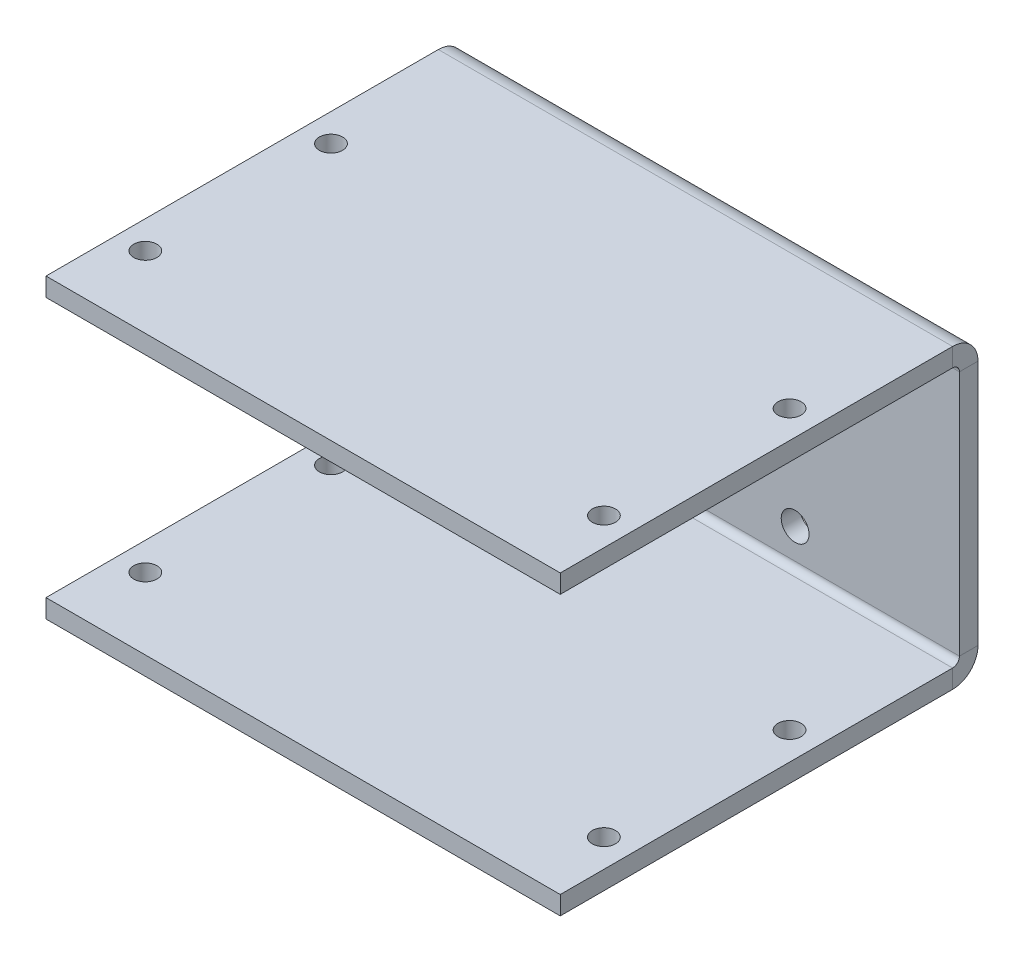
ISO-10303-21;
HEADER;
FILE_DESCRIPTION(('STEP AP214'),'2;1');
FILE_NAME('part.step','',(''),(''),'','','');
FILE_SCHEMA(('AUTOMOTIVE_DESIGN { 1 0 10303 214 1 1 1 1 }'));
ENDSEC;
DATA;
#1=APPLICATION_CONTEXT('core data for automotive mechanical design processes');
#2=APPLICATION_PROTOCOL_DEFINITION('international standard','automotive_design',2000,#1);
#3=PRODUCT_CONTEXT('',#1,'mechanical');
#4=PRODUCT('Part','Part','',(#3));
#5=PRODUCT_RELATED_PRODUCT_CATEGORY('part','',(#4));
#6=PRODUCT_DEFINITION_FORMATION('','',#4);
#7=PRODUCT_DEFINITION_CONTEXT('part definition',#1,'design');
#8=PRODUCT_DEFINITION('design','',#6,#7);
#9=PRODUCT_DEFINITION_SHAPE('','',#8);
#10=(LENGTH_UNIT() NAMED_UNIT(*) SI_UNIT(.MILLI.,.METRE.));
#11=(NAMED_UNIT(*) PLANE_ANGLE_UNIT() SI_UNIT($,.RADIAN.));
#12=(NAMED_UNIT(*) SI_UNIT($,.STERADIAN.) SOLID_ANGLE_UNIT());
#13=UNCERTAINTY_MEASURE_WITH_UNIT(LENGTH_MEASURE(1.E-05),#10,'distance_accuracy_value','');
#14=(GEOMETRIC_REPRESENTATION_CONTEXT(3) GLOBAL_UNCERTAINTY_ASSIGNED_CONTEXT((#13)) GLOBAL_UNIT_ASSIGNED_CONTEXT((#10,
#11,#12)) REPRESENTATION_CONTEXT('',''));
#15=CARTESIAN_POINT('',(0.,0.,0.));
#16=DIRECTION('',(0.,0.,1.));
#17=DIRECTION('',(1.,0.,0.));
#18=AXIS2_PLACEMENT_3D('',#15,#16,#17);
#19=CARTESIAN_POINT('',(0.,0.,-2.));
#20=DIRECTION('',(0.,0.,-1.));
#21=DIRECTION('',(-1.,0.,0.));
#22=AXIS2_PLACEMENT_3D('',#19,#20,#21);
#23=PLANE('',#22);
#24=CARTESIAN_POINT('',(10.,10.,-2.));
#25=DIRECTION('',(0.,0.,-1.));
#26=DIRECTION('',(-1.,0.,0.));
#27=AXIS2_PLACEMENT_3D('',#24,#25,#26);
#28=CIRCLE('',#27,1.5);
#29=CARTESIAN_POINT('',(8.5,10.,-2.));
#30=VERTEX_POINT('',#29);
#31=EDGE_CURVE('E238',#30,#30,#28,.T.);
#32=ORIENTED_EDGE('',*,*,#31,.F.);
#33=EDGE_LOOP('',(#32));
#34=FACE_BOUND('',#33,.T.);
#35=CARTESIAN_POINT('',(-10.,10.,-2.));
#36=DIRECTION('',(0.,0.,-1.));
#37=DIRECTION('',(-1.,0.,0.));
#38=AXIS2_PLACEMENT_3D('',#35,#36,#37);
#39=CIRCLE('',#38,1.5);
#40=CARTESIAN_POINT('',(-11.5,10.,-2.));
#41=VERTEX_POINT('',#40);
#42=EDGE_CURVE('E246',#41,#41,#39,.T.);
#43=ORIENTED_EDGE('',*,*,#42,.F.);
#44=EDGE_LOOP('',(#43));
#45=FACE_BOUND('',#44,.T.);
#46=CARTESIAN_POINT('',(-10.,-10.,-2.));
#47=DIRECTION('',(0.,0.,-1.));
#48=DIRECTION('',(-1.,0.,0.));
#49=AXIS2_PLACEMENT_3D('',#46,#47,#48);
#50=CIRCLE('',#49,1.5);
#51=CARTESIAN_POINT('',(-11.5,-10.,-2.));
#52=VERTEX_POINT('',#51);
#53=EDGE_CURVE('E250',#52,#52,#50,.T.);
#54=ORIENTED_EDGE('',*,*,#53,.F.);
#55=EDGE_LOOP('',(#54));
#56=FACE_BOUND('',#55,.T.);
#57=CARTESIAN_POINT('',(10.,-10.,-2.));
#58=DIRECTION('',(0.,0.,-1.));
#59=DIRECTION('',(-1.,0.,0.));
#60=AXIS2_PLACEMENT_3D('',#57,#58,#59);
#61=CIRCLE('',#60,1.5);
#62=CARTESIAN_POINT('',(8.5,-10.,-2.));
#63=VERTEX_POINT('',#62);
#64=EDGE_CURVE('E256',#63,#63,#61,.T.);
#65=ORIENTED_EDGE('',*,*,#64,.F.);
#66=EDGE_LOOP('',(#65));
#67=FACE_BOUND('',#66,.T.);
#68=DIRECTION('',(0.,1.,0.));
#69=VECTOR('',#68,1.);
#70=CARTESIAN_POINT('',(27.7,-14.,-2.));
#71=LINE('',#70,#69);
#72=CARTESIAN_POINT('',(27.7,-13.2634,-2.));
#73=VERTEX_POINT('',#72);
#74=CARTESIAN_POINT('',(27.7,13.2634,-2.));
#75=VERTEX_POINT('',#74);
#76=EDGE_CURVE('E49',#73,#75,#71,.T.);
#77=ORIENTED_EDGE('',*,*,#76,.F.);
#78=DIRECTION('',(1.,0.,0.));
#79=VECTOR('',#78,1.);
#80=CARTESIAN_POINT('',(27.7,-13.2634,-2.));
#81=LINE('',#80,#79);
#82=CARTESIAN_POINT('',(-27.7,-13.2634,-2.));
#83=VERTEX_POINT('',#82);
#84=EDGE_CURVE('E135',#73,#83,#81,.F.);
#85=ORIENTED_EDGE('',*,*,#84,.T.);
#86=DIRECTION('',(0.,-1.,0.));
#87=VECTOR('',#86,1.);
#88=CARTESIAN_POINT('',(-27.7,-14.,-2.));
#89=LINE('',#88,#87);
#90=CARTESIAN_POINT('',(-27.7,13.2634,-2.));
#91=VERTEX_POINT('',#90);
#92=EDGE_CURVE('E11',#91,#83,#89,.T.);
#93=ORIENTED_EDGE('',*,*,#92,.F.);
#94=DIRECTION('',(-1.,0.,0.));
#95=VECTOR('',#94,1.);
#96=CARTESIAN_POINT('',(-27.7,13.2634,-2.));
#97=LINE('',#96,#95);
#98=EDGE_CURVE('E221',#91,#75,#97,.F.);
#99=ORIENTED_EDGE('',*,*,#98,.T.);
#100=EDGE_LOOP('',(#77,#85,#93,#99));
#101=FACE_BOUND('',#100,.T.);
#102=ADVANCED_FACE('F40',(#34,#45,#56,#67,#101),#23,.T.);
#103=CARTESIAN_POINT('',(0.,0.,0.));
#104=DIRECTION('',(0.,0.,-1.));
#105=DIRECTION('',(-1.,0.,0.));
#106=AXIS2_PLACEMENT_3D('',#103,#104,#105);
#107=PLANE('',#106);
#108=CARTESIAN_POINT('',(10.,10.,0.));
#109=DIRECTION('',(0.,0.,-1.));
#110=DIRECTION('',(-1.,0.,0.));
#111=AXIS2_PLACEMENT_3D('',#108,#109,#110);
#112=CIRCLE('',#111,1.5);
#113=CARTESIAN_POINT('',(8.5,10.,0.));
#114=VERTEX_POINT('',#113);
#115=EDGE_CURVE('E243',#114,#114,#112,.T.);
#116=ORIENTED_EDGE('',*,*,#115,.T.);
#117=EDGE_LOOP('',(#116));
#118=FACE_BOUND('',#117,.T.);
#119=CARTESIAN_POINT('',(-10.,10.,0.));
#120=DIRECTION('',(0.,0.,-1.));
#121=DIRECTION('',(-1.,0.,0.));
#122=AXIS2_PLACEMENT_3D('',#119,#120,#121);
#123=CIRCLE('',#122,1.5);
#124=CARTESIAN_POINT('',(-11.5,10.,0.));
#125=VERTEX_POINT('',#124);
#126=EDGE_CURVE('E249',#125,#125,#123,.T.);
#127=ORIENTED_EDGE('',*,*,#126,.T.);
#128=EDGE_LOOP('',(#127));
#129=FACE_BOUND('',#128,.T.);
#130=CARTESIAN_POINT('',(-10.,-10.,0.));
#131=DIRECTION('',(0.,0.,-1.));
#132=DIRECTION('',(-1.,0.,0.));
#133=AXIS2_PLACEMENT_3D('',#130,#131,#132);
#134=CIRCLE('',#133,1.5);
#135=CARTESIAN_POINT('',(-11.5,-10.,0.));
#136=VERTEX_POINT('',#135);
#137=EDGE_CURVE('E253',#136,#136,#134,.T.);
#138=ORIENTED_EDGE('',*,*,#137,.T.);
#139=EDGE_LOOP('',(#138));
#140=FACE_BOUND('',#139,.T.);
#141=CARTESIAN_POINT('',(10.,-10.,0.));
#142=DIRECTION('',(0.,0.,-1.));
#143=DIRECTION('',(-1.,0.,0.));
#144=AXIS2_PLACEMENT_3D('',#141,#142,#143);
#145=CIRCLE('',#144,1.5);
#146=CARTESIAN_POINT('',(8.5,-10.,0.));
#147=VERTEX_POINT('',#146);
#148=EDGE_CURVE('E259',#147,#147,#145,.T.);
#149=ORIENTED_EDGE('',*,*,#148,.T.);
#150=EDGE_LOOP('',(#149));
#151=FACE_BOUND('',#150,.T.);
#152=DIRECTION('',(1.,0.,0.));
#153=VECTOR('',#152,1.);
#154=CARTESIAN_POINT('',(27.7,-13.2634,0.));
#155=LINE('',#154,#153);
#156=CARTESIAN_POINT('',(27.7,-13.2634,0.));
#157=VERTEX_POINT('',#156);
#158=CARTESIAN_POINT('',(-27.7,-13.2634,0.));
#159=VERTEX_POINT('',#158);
#160=EDGE_CURVE('E184',#157,#159,#155,.F.);
#161=ORIENTED_EDGE('',*,*,#160,.F.);
#162=DIRECTION('',(0.,1.,0.));
#163=VECTOR('',#162,1.);
#164=CARTESIAN_POINT('',(27.7,-14.,0.));
#165=LINE('',#164,#163);
#166=CARTESIAN_POINT('',(27.7,13.2634,0.));
#167=VERTEX_POINT('',#166);
#168=EDGE_CURVE('E262',#157,#167,#165,.T.);
#169=ORIENTED_EDGE('',*,*,#168,.T.);
#170=DIRECTION('',(-1.,0.,0.));
#171=VECTOR('',#170,1.);
#172=CARTESIAN_POINT('',(-27.7,13.2634,0.));
#173=LINE('',#172,#171);
#174=CARTESIAN_POINT('',(-27.7,13.2634,0.));
#175=VERTEX_POINT('',#174);
#176=EDGE_CURVE('E232',#175,#167,#173,.F.);
#177=ORIENTED_EDGE('',*,*,#176,.F.);
#178=DIRECTION('',(0.,-1.,0.));
#179=VECTOR('',#178,1.);
#180=CARTESIAN_POINT('',(-27.7,-14.,0.));
#181=LINE('',#180,#179);
#182=EDGE_CURVE('E264',#175,#159,#181,.T.);
#183=ORIENTED_EDGE('',*,*,#182,.T.);
#184=EDGE_LOOP('',(#161,#169,#177,#183));
#185=FACE_BOUND('',#184,.T.);
#186=ADVANCED_FACE('F347',(#118,#129,#140,#151,#185),#107,.F.);
#187=CARTESIAN_POINT('',(27.7,-14.,-2.));
#188=DIRECTION('',(1.,0.,0.));
#189=DIRECTION('',(0.,0.,-1.));
#190=AXIS2_PLACEMENT_3D('',#187,#188,#189);
#191=PLANE('',#190);
#192=ORIENTED_EDGE('',*,*,#168,.F.);
#193=DIRECTION('',(0.,0.,-1.));
#194=VECTOR('',#193,1.);
#195=CARTESIAN_POINT('',(27.7,-13.2634,0.));
#196=LINE('',#195,#194);
#197=EDGE_CURVE('E180',#157,#73,#196,.T.);
#198=ORIENTED_EDGE('',*,*,#197,.T.);
#199=ORIENTED_EDGE('',*,*,#76,.T.);
#200=DIRECTION('',(0.,0.,-1.));
#201=VECTOR('',#200,1.);
#202=CARTESIAN_POINT('',(27.7,13.2634,0.));
#203=LINE('',#202,#201);
#204=EDGE_CURVE('E236',#167,#75,#203,.T.);
#205=ORIENTED_EDGE('',*,*,#204,.F.);
#206=EDGE_LOOP('',(#192,#198,#199,#205));
#207=FACE_BOUND('',#206,.T.);
#208=ADVANCED_FACE('F42',(#207),#191,.T.);
#209=CARTESIAN_POINT('',(-27.7,-14.,-2.));
#210=DIRECTION('',(-1.,0.,0.));
#211=DIRECTION('',(0.,0.,1.));
#212=AXIS2_PLACEMENT_3D('',#209,#210,#211);
#213=PLANE('',#212);
#214=DIRECTION('',(0.,0.,-1.));
#215=VECTOR('',#214,1.);
#216=CARTESIAN_POINT('',(-27.7,-13.2634,0.));
#217=LINE('',#216,#215);
#218=EDGE_CURVE('E187',#159,#83,#217,.T.);
#219=ORIENTED_EDGE('',*,*,#218,.F.);
#220=ORIENTED_EDGE('',*,*,#182,.F.);
#221=DIRECTION('',(0.,0.,-1.));
#222=VECTOR('',#221,1.);
#223=CARTESIAN_POINT('',(-27.7,13.2634,0.));
#224=LINE('',#223,#222);
#225=EDGE_CURVE('E226',#175,#91,#224,.T.);
#226=ORIENTED_EDGE('',*,*,#225,.T.);
#227=ORIENTED_EDGE('',*,*,#92,.T.);
#228=EDGE_LOOP('',(#219,#220,#226,#227));
#229=FACE_BOUND('',#228,.T.);
#230=ADVANCED_FACE('F360',(#229),#213,.T.);
#231=CARTESIAN_POINT('',(10.,-10.,-2.));
#232=DIRECTION('',(0.,0.,-1.));
#233=DIRECTION('',(-1.,0.,0.));
#234=AXIS2_PLACEMENT_3D('',#231,#232,#233);
#235=CYLINDRICAL_SURFACE('',#234,1.5);
#236=ORIENTED_EDGE('',*,*,#64,.T.);
#237=EDGE_LOOP('',(#236));
#238=FACE_BOUND('',#237,.T.);
#239=ORIENTED_EDGE('',*,*,#148,.F.);
#240=EDGE_LOOP('',(#239));
#241=FACE_BOUND('',#240,.T.);
#242=ADVANCED_FACE('F358',(#238,#241),#235,.F.);
#243=CARTESIAN_POINT('',(-10.,-10.,-2.));
#244=DIRECTION('',(0.,0.,-1.));
#245=DIRECTION('',(-1.,0.,0.));
#246=AXIS2_PLACEMENT_3D('',#243,#244,#245);
#247=CYLINDRICAL_SURFACE('',#246,1.5);
#248=ORIENTED_EDGE('',*,*,#53,.T.);
#249=EDGE_LOOP('',(#248));
#250=FACE_BOUND('',#249,.T.);
#251=ORIENTED_EDGE('',*,*,#137,.F.);
#252=EDGE_LOOP('',(#251));
#253=FACE_BOUND('',#252,.T.);
#254=ADVANCED_FACE('F367',(#250,#253),#247,.F.);
#255=CARTESIAN_POINT('',(-10.,10.,-2.));
#256=DIRECTION('',(0.,0.,-1.));
#257=DIRECTION('',(-1.,0.,0.));
#258=AXIS2_PLACEMENT_3D('',#255,#256,#257);
#259=CYLINDRICAL_SURFACE('',#258,1.5);
#260=ORIENTED_EDGE('',*,*,#42,.T.);
#261=EDGE_LOOP('',(#260));
#262=FACE_BOUND('',#261,.T.);
#263=ORIENTED_EDGE('',*,*,#126,.F.);
#264=EDGE_LOOP('',(#263));
#265=FACE_BOUND('',#264,.T.);
#266=ADVANCED_FACE('F425',(#262,#265),#259,.F.);
#267=CARTESIAN_POINT('',(10.,10.,-2.));
#268=DIRECTION('',(0.,0.,-1.));
#269=DIRECTION('',(-1.,0.,0.));
#270=AXIS2_PLACEMENT_3D('',#267,#268,#269);
#271=CYLINDRICAL_SURFACE('',#270,1.5);
#272=ORIENTED_EDGE('',*,*,#31,.T.);
#273=EDGE_LOOP('',(#272));
#274=FACE_BOUND('',#273,.T.);
#275=ORIENTED_EDGE('',*,*,#115,.F.);
#276=EDGE_LOOP('',(#275));
#277=FACE_BOUND('',#276,.T.);
#278=ADVANCED_FACE('F420',(#274,#277),#271,.F.);
#279=CARTESIAN_POINT('',(27.7,13.2634,0.7366));
#280=DIRECTION('',(1.,0.,0.));
#281=DIRECTION('',(0.,0.,-1.));
#282=AXIS2_PLACEMENT_3D('',#279,#280,#281);
#283=PLANE('',#282);
#284=DIRECTION('',(0.,1.,0.));
#285=VECTOR('',#284,1.);
#286=CARTESIAN_POINT('',(27.7,14.,0.736599999999997));
#287=LINE('',#286,#285);
#288=CARTESIAN_POINT('',(27.7,14.,0.736599999999997));
#289=VERTEX_POINT('',#288);
#290=CARTESIAN_POINT('',(27.7,16.,0.73659999999999));
#291=VERTEX_POINT('',#290);
#292=EDGE_CURVE('E189',#289,#291,#287,.T.);
#293=ORIENTED_EDGE('',*,*,#292,.F.);
#294=CARTESIAN_POINT('',(27.7,13.2634,0.7366));
#295=DIRECTION('',(-1.,0.,0.));
#296=DIRECTION('',(0.,0.,1.));
#297=AXIS2_PLACEMENT_3D('',#294,#295,#296);
#298=CIRCLE('',#297,0.7366);
#299=EDGE_CURVE('E229',#167,#289,#298,.F.);
#300=ORIENTED_EDGE('',*,*,#299,.F.);
#301=ORIENTED_EDGE('',*,*,#204,.T.);
#302=CARTESIAN_POINT('',(27.7,13.2634,0.7366));
#303=DIRECTION('',(-1.,0.,0.));
#304=DIRECTION('',(0.,0.,1.));
#305=AXIS2_PLACEMENT_3D('',#302,#303,#304);
#306=CIRCLE('',#305,2.7366);
#307=EDGE_CURVE('E57',#75,#291,#306,.F.);
#308=ORIENTED_EDGE('',*,*,#307,.T.);
#309=EDGE_LOOP('',(#293,#300,#301,#308));
#310=FACE_BOUND('',#309,.T.);
#311=ADVANCED_FACE('F382',(#310),#283,.T.);
#312=CARTESIAN_POINT('',(-27.7,13.2634,0.7366));
#313=DIRECTION('',(1.,0.,0.));
#314=DIRECTION('',(0.,0.,-1.));
#315=AXIS2_PLACEMENT_3D('',#312,#313,#314);
#316=PLANE('',#315);
#317=CARTESIAN_POINT('',(-27.7,13.2634,0.7366));
#318=DIRECTION('',(-1.,0.,0.));
#319=DIRECTION('',(0.,0.,1.));
#320=AXIS2_PLACEMENT_3D('',#317,#318,#319);
#321=CIRCLE('',#320,0.7366);
#322=CARTESIAN_POINT('',(-27.7,14.,0.736599999999997));
#323=VERTEX_POINT('',#322);
#324=EDGE_CURVE('E220',#323,#175,#321,.T.);
#325=ORIENTED_EDGE('',*,*,#324,.F.);
#326=DIRECTION('',(0.,1.,0.));
#327=VECTOR('',#326,1.);
#328=CARTESIAN_POINT('',(-27.7,14.,0.736599999999997));
#329=LINE('',#328,#327);
#330=CARTESIAN_POINT('',(-27.7,16.,0.73659999999999));
#331=VERTEX_POINT('',#330);
#332=EDGE_CURVE('E193',#323,#331,#329,.T.);
#333=ORIENTED_EDGE('',*,*,#332,.T.);
#334=CARTESIAN_POINT('',(-27.7,13.2634,0.7366));
#335=DIRECTION('',(-1.,0.,0.));
#336=DIRECTION('',(0.,0.,1.));
#337=AXIS2_PLACEMENT_3D('',#334,#335,#336);
#338=CIRCLE('',#337,2.7366);
#339=EDGE_CURVE('E224',#331,#91,#338,.T.);
#340=ORIENTED_EDGE('',*,*,#339,.T.);
#341=ORIENTED_EDGE('',*,*,#225,.F.);
#342=EDGE_LOOP('',(#325,#333,#340,#341));
#343=FACE_BOUND('',#342,.T.);
#344=ADVANCED_FACE('F402',(#343),#316,.F.);
#345=CARTESIAN_POINT('',(-27.7,13.2634,0.7366));
#346=DIRECTION('',(-1.,0.,0.));
#347=DIRECTION('',(0.,1.,0.));
#348=AXIS2_PLACEMENT_3D('',#345,#346,#347);
#349=CYLINDRICAL_SURFACE('',#348,2.7366);
#350=ORIENTED_EDGE('',*,*,#98,.F.);
#351=ORIENTED_EDGE('',*,*,#339,.F.);
#352=DIRECTION('',(1.,0.,0.));
#353=VECTOR('',#352,1.);
#354=CARTESIAN_POINT('',(0.,16.,0.73659999999999));
#355=LINE('',#354,#353);
#356=EDGE_CURVE('E196',#331,#291,#355,.T.);
#357=ORIENTED_EDGE('',*,*,#356,.T.);
#358=ORIENTED_EDGE('',*,*,#307,.F.);
#359=EDGE_LOOP('',(#350,#351,#357,#358));
#360=FACE_BOUND('',#359,.T.);
#361=ADVANCED_FACE('F412',(#360),#349,.T.);
#362=CARTESIAN_POINT('',(-27.7,13.2634,0.7366));
#363=DIRECTION('',(-1.,0.,0.));
#364=DIRECTION('',(0.,1.,0.));
#365=AXIS2_PLACEMENT_3D('',#362,#363,#364);
#366=CYLINDRICAL_SURFACE('',#365,0.7366);
#367=ORIENTED_EDGE('',*,*,#176,.T.);
#368=ORIENTED_EDGE('',*,*,#299,.T.);
#369=DIRECTION('',(-1.,0.,0.));
#370=VECTOR('',#369,1.);
#371=CARTESIAN_POINT('',(27.7,14.,0.736599999999997));
#372=LINE('',#371,#370);
#373=EDGE_CURVE('E191',#289,#323,#372,.T.);
#374=ORIENTED_EDGE('',*,*,#373,.T.);
#375=ORIENTED_EDGE('',*,*,#324,.T.);
#376=EDGE_LOOP('',(#367,#368,#374,#375));
#377=FACE_BOUND('',#376,.T.);
#378=ADVANCED_FACE('F378',(#377),#366,.F.);
#379=CARTESIAN_POINT('',(-27.7,16.0000000000002,43.));
#380=DIRECTION('',(1.,0.,0.));
#381=DIRECTION('',(0.,0.,-1.));
#382=AXIS2_PLACEMENT_3D('',#379,#380,#381);
#383=PLANE('',#382);
#384=ORIENTED_EDGE('',*,*,#332,.F.);
#385=DIRECTION('',(0.,0.,1.));
#386=VECTOR('',#385,1.);
#387=CARTESIAN_POINT('',(-27.7,14.0000000000002,43.));
#388=LINE('',#387,#386);
#389=CARTESIAN_POINT('',(-27.7,14.0000000000002,43.));
#390=VERTEX_POINT('',#389);
#391=EDGE_CURVE('E200',#323,#390,#388,.T.);
#392=ORIENTED_EDGE('',*,*,#391,.T.);
#393=DIRECTION('',(0.,-1.,0.));
#394=VECTOR('',#393,1.);
#395=CARTESIAN_POINT('',(-27.7,16.0000000000002,43.));
#396=LINE('',#395,#394);
#397=CARTESIAN_POINT('',(-27.7,16.0000000000002,43.));
#398=VERTEX_POINT('',#397);
#399=EDGE_CURVE('E217',#398,#390,#396,.T.);
#400=ORIENTED_EDGE('',*,*,#399,.F.);
#401=DIRECTION('',(0.,0.,1.));
#402=VECTOR('',#401,1.);
#403=CARTESIAN_POINT('',(-27.7,16.0000000000002,43.));
#404=LINE('',#403,#402);
#405=EDGE_CURVE('E201',#331,#398,#404,.T.);
#406=ORIENTED_EDGE('',*,*,#405,.F.);
#407=EDGE_LOOP('',(#384,#392,#400,#406));
#408=FACE_BOUND('',#407,.T.);
#409=ADVANCED_FACE('F404',(#408),#383,.F.);
#410=CARTESIAN_POINT('',(27.7,16.,0.));
#411=DIRECTION('',(-1.,0.,0.));
#412=DIRECTION('',(0.,0.,1.));
#413=AXIS2_PLACEMENT_3D('',#410,#411,#412);
#414=PLANE('',#413);
#415=ORIENTED_EDGE('',*,*,#292,.T.);
#416=DIRECTION('',(0.,0.,-1.));
#417=VECTOR('',#416,1.);
#418=CARTESIAN_POINT('',(27.7,16.,0.));
#419=LINE('',#418,#417);
#420=CARTESIAN_POINT('',(27.7,16.0000000000002,43.));
#421=VERTEX_POINT('',#420);
#422=EDGE_CURVE('E206',#421,#291,#419,.T.);
#423=ORIENTED_EDGE('',*,*,#422,.F.);
#424=DIRECTION('',(0.,-1.,0.));
#425=VECTOR('',#424,1.);
#426=CARTESIAN_POINT('',(27.7,16.0000000000002,43.));
#427=LINE('',#426,#425);
#428=CARTESIAN_POINT('',(27.7,14.0000000000002,43.));
#429=VERTEX_POINT('',#428);
#430=EDGE_CURVE('E209',#421,#429,#427,.T.);
#431=ORIENTED_EDGE('',*,*,#430,.T.);
#432=DIRECTION('',(0.,0.,-1.));
#433=VECTOR('',#432,1.);
#434=CARTESIAN_POINT('',(27.7,14.,0.));
#435=LINE('',#434,#433);
#436=EDGE_CURVE('E204',#429,#289,#435,.T.);
#437=ORIENTED_EDGE('',*,*,#436,.T.);
#438=EDGE_LOOP('',(#415,#423,#431,#437));
#439=FACE_BOUND('',#438,.T.);
#440=ADVANCED_FACE('F385',(#439),#414,.F.);
#441=CARTESIAN_POINT('',(0.,16.,0.));
#442=DIRECTION('',(0.,-1.,0.));
#443=DIRECTION('',(0.,0.,-1.));
#444=AXIS2_PLACEMENT_3D('',#441,#442,#443);
#445=PLANE('',#444);
#446=CARTESIAN_POINT('',(-24.7,16.0000000000001,35.3));
#447=DIRECTION('',(0.,1.,0.));
#448=DIRECTION('',(0.,0.,1.));
#449=AXIS2_PLACEMENT_3D('',#446,#447,#448);
#450=CIRCLE('',#449,1.25);
#451=CARTESIAN_POINT('',(-24.7,16.0000000000001,36.55));
#452=VERTEX_POINT('',#451);
#453=EDGE_CURVE('E771',#452,#452,#450,.T.);
#454=ORIENTED_EDGE('',*,*,#453,.F.);
#455=EDGE_LOOP('',(#454));
#456=FACE_BOUND('',#455,.T.);
#457=CARTESIAN_POINT('',(-24.7,16.0000000000001,15.3));
#458=DIRECTION('',(0.,1.,0.));
#459=DIRECTION('',(0.,0.,1.));
#460=AXIS2_PLACEMENT_3D('',#457,#458,#459);
#461=CIRCLE('',#460,1.25);
#462=CARTESIAN_POINT('',(-24.7,16.0000000000001,16.55));
#463=VERTEX_POINT('',#462);
#464=EDGE_CURVE('E286',#463,#463,#461,.T.);
#465=ORIENTED_EDGE('',*,*,#464,.F.);
#466=EDGE_LOOP('',(#465));
#467=FACE_BOUND('',#466,.T.);
#468=CARTESIAN_POINT('',(24.7,16.0000000000001,35.3));
#469=DIRECTION('',(0.,1.,0.));
#470=DIRECTION('',(0.,0.,1.));
#471=AXIS2_PLACEMENT_3D('',#468,#469,#470);
#472=CIRCLE('',#471,1.25);
#473=CARTESIAN_POINT('',(24.7,16.0000000000001,36.55));
#474=VERTEX_POINT('',#473);
#475=EDGE_CURVE('E283',#474,#474,#472,.T.);
#476=ORIENTED_EDGE('',*,*,#475,.F.);
#477=EDGE_LOOP('',(#476));
#478=FACE_BOUND('',#477,.T.);
#479=CARTESIAN_POINT('',(24.7,16.0000000000001,15.3));
#480=DIRECTION('',(0.,1.,0.));
#481=DIRECTION('',(0.,0.,1.));
#482=AXIS2_PLACEMENT_3D('',#479,#480,#481);
#483=CIRCLE('',#482,1.25);
#484=CARTESIAN_POINT('',(24.7,16.0000000000001,16.55));
#485=VERTEX_POINT('',#484);
#486=EDGE_CURVE('E306',#485,#485,#483,.T.);
#487=ORIENTED_EDGE('',*,*,#486,.F.);
#488=EDGE_LOOP('',(#487));
#489=FACE_BOUND('',#488,.T.);
#490=ORIENTED_EDGE('',*,*,#356,.F.);
#491=ORIENTED_EDGE('',*,*,#405,.T.);
#492=DIRECTION('',(1.,0.,0.));
#493=VECTOR('',#492,1.);
#494=CARTESIAN_POINT('',(27.7,16.0000000000002,43.));
#495=LINE('',#494,#493);
#496=EDGE_CURVE('E203',#398,#421,#495,.T.);
#497=ORIENTED_EDGE('',*,*,#496,.T.);
#498=ORIENTED_EDGE('',*,*,#422,.T.);
#499=EDGE_LOOP('',(#490,#491,#497,#498));
#500=FACE_BOUND('',#499,.T.);
#501=ADVANCED_FACE('F389',(#456,#467,#478,#489,#500),#445,.F.);
#502=CARTESIAN_POINT('',(0.,14.,0.));
#503=DIRECTION('',(0.,-1.,0.));
#504=DIRECTION('',(0.,0.,-1.));
#505=AXIS2_PLACEMENT_3D('',#502,#503,#504);
#506=PLANE('',#505);
#507=CARTESIAN_POINT('',(-24.7,14.0000000000001,35.3));
#508=DIRECTION('',(0.,-1.,0.));
#509=DIRECTION('',(0.,0.,-1.));
#510=AXIS2_PLACEMENT_3D('',#507,#508,#509);
#511=CIRCLE('',#510,1.25);
#512=CARTESIAN_POINT('',(-24.7,14.0000000000001,34.05));
#513=VERTEX_POINT('',#512);
#514=EDGE_CURVE('E291',#513,#513,#511,.T.);
#515=ORIENTED_EDGE('',*,*,#514,.F.);
#516=EDGE_LOOP('',(#515));
#517=FACE_BOUND('',#516,.T.);
#518=CARTESIAN_POINT('',(-24.7,14.0000000000001,15.3));
#519=DIRECTION('',(0.,-1.,0.));
#520=DIRECTION('',(0.,0.,-1.));
#521=AXIS2_PLACEMENT_3D('',#518,#519,#520);
#522=CIRCLE('',#521,1.25);
#523=CARTESIAN_POINT('',(-24.7,14.,14.05));
#524=VERTEX_POINT('',#523);
#525=EDGE_CURVE('E278',#524,#524,#522,.T.);
#526=ORIENTED_EDGE('',*,*,#525,.F.);
#527=EDGE_LOOP('',(#526));
#528=FACE_BOUND('',#527,.T.);
#529=CARTESIAN_POINT('',(24.7,14.0000000000001,35.3));
#530=DIRECTION('',(0.,-1.,0.));
#531=DIRECTION('',(0.,0.,-1.));
#532=AXIS2_PLACEMENT_3D('',#529,#530,#531);
#533=CIRCLE('',#532,1.25);
#534=CARTESIAN_POINT('',(24.7,14.0000000000001,34.05));
#535=VERTEX_POINT('',#534);
#536=EDGE_CURVE('E303',#535,#535,#533,.T.);
#537=ORIENTED_EDGE('',*,*,#536,.F.);
#538=EDGE_LOOP('',(#537));
#539=FACE_BOUND('',#538,.T.);
#540=CARTESIAN_POINT('',(24.7,14.0000000000001,15.3));
#541=DIRECTION('',(0.,-1.,0.));
#542=DIRECTION('',(0.,0.,-1.));
#543=AXIS2_PLACEMENT_3D('',#540,#541,#542);
#544=CIRCLE('',#543,1.25);
#545=CARTESIAN_POINT('',(24.7,14.,14.05));
#546=VERTEX_POINT('',#545);
#547=EDGE_CURVE('E274',#546,#546,#544,.T.);
#548=ORIENTED_EDGE('',*,*,#547,.F.);
#549=EDGE_LOOP('',(#548));
#550=FACE_BOUND('',#549,.T.);
#551=ORIENTED_EDGE('',*,*,#391,.F.);
#552=ORIENTED_EDGE('',*,*,#373,.F.);
#553=ORIENTED_EDGE('',*,*,#436,.F.);
#554=DIRECTION('',(1.,0.,0.));
#555=VECTOR('',#554,1.);
#556=CARTESIAN_POINT('',(27.7,14.0000000000002,43.));
#557=LINE('',#556,#555);
#558=EDGE_CURVE('E211',#390,#429,#557,.T.);
#559=ORIENTED_EDGE('',*,*,#558,.F.);
#560=EDGE_LOOP('',(#551,#552,#553,#559));
#561=FACE_BOUND('',#560,.T.);
#562=ADVANCED_FACE('F399',(#517,#528,#539,#550,#561),#506,.T.);
#563=CARTESIAN_POINT('',(27.7,16.0000000000002,43.));
#564=DIRECTION('',(0.,0.,-1.));
#565=DIRECTION('',(0.,1.,0.));
#566=AXIS2_PLACEMENT_3D('',#563,#564,#565);
#567=PLANE('',#566);
#568=ORIENTED_EDGE('',*,*,#558,.T.);
#569=ORIENTED_EDGE('',*,*,#430,.F.);
#570=ORIENTED_EDGE('',*,*,#496,.F.);
#571=ORIENTED_EDGE('',*,*,#399,.T.);
#572=EDGE_LOOP('',(#568,#569,#570,#571));
#573=FACE_BOUND('',#572,.T.);
#574=ADVANCED_FACE('F395',(#573),#567,.F.);
#575=CARTESIAN_POINT('',(-27.7,-13.2634,0.7366));
#576=DIRECTION('',(-1.,0.,0.));
#577=DIRECTION('',(0.,0.,1.));
#578=AXIS2_PLACEMENT_3D('',#575,#576,#577);
#579=PLANE('',#578);
#580=DIRECTION('',(0.,-1.,0.));
#581=VECTOR('',#580,1.);
#582=CARTESIAN_POINT('',(-27.7,-14.,0.736599999999997));
#583=LINE('',#582,#581);
#584=CARTESIAN_POINT('',(-27.7,-14.,0.736599999999997));
#585=VERTEX_POINT('',#584);
#586=CARTESIAN_POINT('',(-27.7,-16.,0.73659999999999));
#587=VERTEX_POINT('',#586);
#588=EDGE_CURVE('E313',#585,#587,#583,.T.);
#589=ORIENTED_EDGE('',*,*,#588,.F.);
#590=CARTESIAN_POINT('',(-27.7,-13.2634,0.7366));
#591=DIRECTION('',(1.,0.,0.));
#592=DIRECTION('',(0.,0.,-1.));
#593=AXIS2_PLACEMENT_3D('',#590,#591,#592);
#594=CIRCLE('',#593,0.7366);
#595=EDGE_CURVE('E138',#159,#585,#594,.F.);
#596=ORIENTED_EDGE('',*,*,#595,.F.);
#597=ORIENTED_EDGE('',*,*,#218,.T.);
#598=CARTESIAN_POINT('',(-27.7,-13.2634,0.7366));
#599=DIRECTION('',(1.,0.,0.));
#600=DIRECTION('',(0.,0.,-1.));
#601=AXIS2_PLACEMENT_3D('',#598,#599,#600);
#602=CIRCLE('',#601,2.7366);
#603=EDGE_CURVE('E65',#83,#587,#602,.F.);
#604=ORIENTED_EDGE('',*,*,#603,.T.);
#605=EDGE_LOOP('',(#589,#596,#597,#604));
#606=FACE_BOUND('',#605,.T.);
#607=ADVANCED_FACE('F321',(#606),#579,.T.);
#608=CARTESIAN_POINT('',(27.7,-13.2634,0.7366));
#609=DIRECTION('',(-1.,0.,0.));
#610=DIRECTION('',(0.,0.,1.));
#611=AXIS2_PLACEMENT_3D('',#608,#609,#610);
#612=PLANE('',#611);
#613=CARTESIAN_POINT('',(27.7,-13.2634,0.7366));
#614=DIRECTION('',(1.,0.,0.));
#615=DIRECTION('',(0.,0.,-1.));
#616=AXIS2_PLACEMENT_3D('',#613,#614,#615);
#617=CIRCLE('',#616,0.7366);
#618=CARTESIAN_POINT('',(27.7,-14.,0.736599999999997));
#619=VERTEX_POINT('',#618);
#620=EDGE_CURVE('E145',#619,#157,#617,.T.);
#621=ORIENTED_EDGE('',*,*,#620,.F.);
#622=DIRECTION('',(0.,-1.,0.));
#623=VECTOR('',#622,1.);
#624=CARTESIAN_POINT('',(27.7,-14.,0.736599999999997));
#625=LINE('',#624,#623);
#626=CARTESIAN_POINT('',(27.7,-16.,0.73659999999999));
#627=VERTEX_POINT('',#626);
#628=EDGE_CURVE('E142',#619,#627,#625,.T.);
#629=ORIENTED_EDGE('',*,*,#628,.T.);
#630=CARTESIAN_POINT('',(27.7,-13.2634,0.7366));
#631=DIRECTION('',(1.,0.,0.));
#632=DIRECTION('',(0.,0.,-1.));
#633=AXIS2_PLACEMENT_3D('',#630,#631,#632);
#634=CIRCLE('',#633,2.7366);
#635=EDGE_CURVE('E129',#627,#73,#634,.T.);
#636=ORIENTED_EDGE('',*,*,#635,.T.);
#637=ORIENTED_EDGE('',*,*,#197,.F.);
#638=EDGE_LOOP('',(#621,#629,#636,#637));
#639=FACE_BOUND('',#638,.T.);
#640=ADVANCED_FACE('F143',(#639),#612,.F.);
#641=CARTESIAN_POINT('',(27.7,-13.2634,0.7366));
#642=DIRECTION('',(1.,0.,0.));
#643=DIRECTION('',(0.,-1.,0.));
#644=AXIS2_PLACEMENT_3D('',#641,#642,#643);
#645=CYLINDRICAL_SURFACE('',#644,2.7366);
#646=ORIENTED_EDGE('',*,*,#84,.F.);
#647=ORIENTED_EDGE('',*,*,#635,.F.);
#648=DIRECTION('',(-1.,0.,0.));
#649=VECTOR('',#648,1.);
#650=CARTESIAN_POINT('',(0.,-16.,0.73659999999999));
#651=LINE('',#650,#649);
#652=EDGE_CURVE('E133',#627,#587,#651,.T.);
#653=ORIENTED_EDGE('',*,*,#652,.T.);
#654=ORIENTED_EDGE('',*,*,#603,.F.);
#655=EDGE_LOOP('',(#646,#647,#653,#654));
#656=FACE_BOUND('',#655,.T.);
#657=ADVANCED_FACE('F131',(#656),#645,.T.);
#658=CARTESIAN_POINT('',(27.7,-13.2634,0.7366));
#659=DIRECTION('',(1.,0.,0.));
#660=DIRECTION('',(0.,-1.,0.));
#661=AXIS2_PLACEMENT_3D('',#658,#659,#660);
#662=CYLINDRICAL_SURFACE('',#661,0.7366);
#663=ORIENTED_EDGE('',*,*,#160,.T.);
#664=ORIENTED_EDGE('',*,*,#595,.T.);
#665=DIRECTION('',(1.,0.,0.));
#666=VECTOR('',#665,1.);
#667=CARTESIAN_POINT('',(-27.7,-14.,0.736599999999997));
#668=LINE('',#667,#666);
#669=EDGE_CURVE('E149',#585,#619,#668,.T.);
#670=ORIENTED_EDGE('',*,*,#669,.T.);
#671=ORIENTED_EDGE('',*,*,#620,.T.);
#672=EDGE_LOOP('',(#663,#664,#670,#671));
#673=FACE_BOUND('',#672,.T.);
#674=ADVANCED_FACE('F325',(#673),#662,.F.);
#675=CARTESIAN_POINT('',(-27.7,-16.,0.));
#676=DIRECTION('',(1.,0.,0.));
#677=DIRECTION('',(0.,0.,-1.));
#678=AXIS2_PLACEMENT_3D('',#675,#676,#677);
#679=PLANE('',#678);
#680=ORIENTED_EDGE('',*,*,#588,.T.);
#681=DIRECTION('',(0.,0.,-1.));
#682=VECTOR('',#681,1.);
#683=CARTESIAN_POINT('',(-27.7,-16.,0.));
#684=LINE('',#683,#682);
#685=CARTESIAN_POINT('',(-27.7,-16.0000000000002,43.));
#686=VERTEX_POINT('',#685);
#687=EDGE_CURVE('E157',#686,#587,#684,.T.);
#688=ORIENTED_EDGE('',*,*,#687,.F.);
#689=DIRECTION('',(0.,1.,0.));
#690=VECTOR('',#689,1.);
#691=CARTESIAN_POINT('',(-27.7,-16.0000000000002,43.));
#692=LINE('',#691,#690);
#693=CARTESIAN_POINT('',(-27.7,-14.0000000000002,43.));
#694=VERTEX_POINT('',#693);
#695=EDGE_CURVE('E166',#686,#694,#692,.T.);
#696=ORIENTED_EDGE('',*,*,#695,.T.);
#697=DIRECTION('',(0.,0.,-1.));
#698=VECTOR('',#697,1.);
#699=CARTESIAN_POINT('',(-27.7,-14.,0.));
#700=LINE('',#699,#698);
#701=EDGE_CURVE('E158',#694,#585,#700,.T.);
#702=ORIENTED_EDGE('',*,*,#701,.T.);
#703=EDGE_LOOP('',(#680,#688,#696,#702));
#704=FACE_BOUND('',#703,.T.);
#705=ADVANCED_FACE('F317',(#704),#679,.F.);
#706=CARTESIAN_POINT('',(27.7,-16.0000000000002,43.));
#707=DIRECTION('',(-1.,0.,0.));
#708=DIRECTION('',(0.,0.,1.));
#709=AXIS2_PLACEMENT_3D('',#706,#707,#708);
#710=PLANE('',#709);
#711=ORIENTED_EDGE('',*,*,#628,.F.);
#712=DIRECTION('',(0.,0.,1.));
#713=VECTOR('',#712,1.);
#714=CARTESIAN_POINT('',(27.7,-14.0000000000002,43.));
#715=LINE('',#714,#713);
#716=CARTESIAN_POINT('',(27.7,-14.0000000000002,43.));
#717=VERTEX_POINT('',#716);
#718=EDGE_CURVE('E173',#619,#717,#715,.T.);
#719=ORIENTED_EDGE('',*,*,#718,.T.);
#720=DIRECTION('',(0.,1.,0.));
#721=VECTOR('',#720,1.);
#722=CARTESIAN_POINT('',(27.7,-16.0000000000002,43.));
#723=LINE('',#722,#721);
#724=CARTESIAN_POINT('',(27.7,-16.0000000000002,43.));
#725=VERTEX_POINT('',#724);
#726=EDGE_CURVE('E162',#725,#717,#723,.T.);
#727=ORIENTED_EDGE('',*,*,#726,.F.);
#728=DIRECTION('',(0.,0.,1.));
#729=VECTOR('',#728,1.);
#730=CARTESIAN_POINT('',(27.7,-16.0000000000002,43.));
#731=LINE('',#730,#729);
#732=EDGE_CURVE('E154',#627,#725,#731,.T.);
#733=ORIENTED_EDGE('',*,*,#732,.F.);
#734=EDGE_LOOP('',(#711,#719,#727,#733));
#735=FACE_BOUND('',#734,.T.);
#736=ADVANCED_FACE('F160',(#735),#710,.F.);
#737=CARTESIAN_POINT('',(0.,-16.,0.));
#738=DIRECTION('',(0.,1.,0.));
#739=DIRECTION('',(0.,0.,1.));
#740=AXIS2_PLACEMENT_3D('',#737,#738,#739);
#741=PLANE('',#740);
#742=CARTESIAN_POINT('',(-24.7,-16.0000000000002,35.3000000000001));
#743=DIRECTION('',(0.,1.,0.));
#744=DIRECTION('',(0.,0.,1.));
#745=AXIS2_PLACEMENT_3D('',#742,#743,#744);
#746=CIRCLE('',#745,1.24999999999999);
#747=CARTESIAN_POINT('',(-24.7,-16.0000000000002,36.5500000000001));
#748=VERTEX_POINT('',#747);
#749=EDGE_CURVE('E772',#748,#748,#746,.T.);
#750=ORIENTED_EDGE('',*,*,#749,.T.);
#751=EDGE_LOOP('',(#750));
#752=FACE_BOUND('',#751,.T.);
#753=CARTESIAN_POINT('',(-24.7,-16.0000000000002,15.3000000000001));
#754=DIRECTION('',(0.,1.,0.));
#755=DIRECTION('',(0.,0.,1.));
#756=AXIS2_PLACEMENT_3D('',#753,#754,#755);
#757=CIRCLE('',#756,1.24999999999999);
#758=CARTESIAN_POINT('',(-24.7,-16.0000000000002,16.5500000000001));
#759=VERTEX_POINT('',#758);
#760=EDGE_CURVE('E279',#759,#759,#757,.T.);
#761=ORIENTED_EDGE('',*,*,#760,.T.);
#762=EDGE_LOOP('',(#761));
#763=FACE_BOUND('',#762,.T.);
#764=CARTESIAN_POINT('',(24.7,-16.0000000000002,35.3000000000001));
#765=DIRECTION('',(0.,1.,0.));
#766=DIRECTION('',(0.,0.,1.));
#767=AXIS2_PLACEMENT_3D('',#764,#765,#766);
#768=CIRCLE('',#767,1.24999999999999);
#769=CARTESIAN_POINT('',(24.7,-16.0000000000002,36.5500000000001));
#770=VERTEX_POINT('',#769);
#771=EDGE_CURVE('E297',#770,#770,#768,.T.);
#772=ORIENTED_EDGE('',*,*,#771,.T.);
#773=EDGE_LOOP('',(#772));
#774=FACE_BOUND('',#773,.T.);
#775=CARTESIAN_POINT('',(24.7,-16.0000000000002,15.3000000000001));
#776=DIRECTION('',(0.,1.,0.));
#777=DIRECTION('',(0.,0.,1.));
#778=AXIS2_PLACEMENT_3D('',#775,#776,#777);
#779=CIRCLE('',#778,1.24999999999999);
#780=CARTESIAN_POINT('',(24.7,-16.0000000000002,16.5500000000001));
#781=VERTEX_POINT('',#780);
#782=EDGE_CURVE('E275',#781,#781,#779,.T.);
#783=ORIENTED_EDGE('',*,*,#782,.T.);
#784=EDGE_LOOP('',(#783));
#785=FACE_BOUND('',#784,.T.);
#786=ORIENTED_EDGE('',*,*,#652,.F.);
#787=ORIENTED_EDGE('',*,*,#732,.T.);
#788=DIRECTION('',(-1.,0.,0.));
#789=VECTOR('',#788,1.);
#790=CARTESIAN_POINT('',(-27.7,-16.0000000000002,43.));
#791=LINE('',#790,#789);
#792=EDGE_CURVE('E164',#725,#686,#791,.T.);
#793=ORIENTED_EDGE('',*,*,#792,.T.);
#794=ORIENTED_EDGE('',*,*,#687,.T.);
#795=EDGE_LOOP('',(#786,#787,#793,#794));
#796=FACE_BOUND('',#795,.T.);
#797=ADVANCED_FACE('F153',(#752,#763,#774,#785,#796),#741,.F.);
#798=CARTESIAN_POINT('',(0.,-14.,0.));
#799=DIRECTION('',(0.,1.,0.));
#800=DIRECTION('',(0.,0.,1.));
#801=AXIS2_PLACEMENT_3D('',#798,#799,#800);
#802=PLANE('',#801);
#803=CARTESIAN_POINT('',(-24.7,-14.0000000000001,35.3000000000001));
#804=DIRECTION('',(0.,1.,0.));
#805=DIRECTION('',(0.,0.,1.));
#806=AXIS2_PLACEMENT_3D('',#803,#804,#805);
#807=CIRCLE('',#806,1.25);
#808=CARTESIAN_POINT('',(-24.7,-14.0000000000001,36.5500000000001));
#809=VERTEX_POINT('',#808);
#810=EDGE_CURVE('E44',#809,#809,#807,.T.);
#811=ORIENTED_EDGE('',*,*,#810,.F.);
#812=EDGE_LOOP('',(#811));
#813=FACE_BOUND('',#812,.T.);
#814=CARTESIAN_POINT('',(-24.7,-14.0000000000001,15.3000000000001));
#815=DIRECTION('',(0.,1.,0.));
#816=DIRECTION('',(0.,0.,1.));
#817=AXIS2_PLACEMENT_3D('',#814,#815,#816);
#818=CIRCLE('',#817,1.25);
#819=CARTESIAN_POINT('',(-24.7,-14.0000000000001,16.5500000000001));
#820=VERTEX_POINT('',#819);
#821=EDGE_CURVE('E276',#820,#820,#818,.T.);
#822=ORIENTED_EDGE('',*,*,#821,.F.);
#823=EDGE_LOOP('',(#822));
#824=FACE_BOUND('',#823,.T.);
#825=CARTESIAN_POINT('',(24.7,-14.0000000000001,35.3000000000001));
#826=DIRECTION('',(0.,1.,0.));
#827=DIRECTION('',(0.,0.,1.));
#828=AXIS2_PLACEMENT_3D('',#825,#826,#827);
#829=CIRCLE('',#828,1.25);
#830=CARTESIAN_POINT('',(24.7,-14.0000000000001,36.5500000000001));
#831=VERTEX_POINT('',#830);
#832=EDGE_CURVE('E300',#831,#831,#829,.T.);
#833=ORIENTED_EDGE('',*,*,#832,.F.);
#834=EDGE_LOOP('',(#833));
#835=FACE_BOUND('',#834,.T.);
#836=CARTESIAN_POINT('',(24.7,-14.0000000000001,15.3000000000001));
#837=DIRECTION('',(0.,1.,0.));
#838=DIRECTION('',(0.,0.,1.));
#839=AXIS2_PLACEMENT_3D('',#836,#837,#838);
#840=CIRCLE('',#839,1.25);
#841=CARTESIAN_POINT('',(24.7,-14.0000000000001,16.5500000000001));
#842=VERTEX_POINT('',#841);
#843=EDGE_CURVE('E272',#842,#842,#840,.T.);
#844=ORIENTED_EDGE('',*,*,#843,.F.);
#845=EDGE_LOOP('',(#844));
#846=FACE_BOUND('',#845,.T.);
#847=ORIENTED_EDGE('',*,*,#718,.F.);
#848=ORIENTED_EDGE('',*,*,#669,.F.);
#849=ORIENTED_EDGE('',*,*,#701,.F.);
#850=DIRECTION('',(-1.,0.,0.));
#851=VECTOR('',#850,1.);
#852=CARTESIAN_POINT('',(-27.7,-14.0000000000002,43.));
#853=LINE('',#852,#851);
#854=EDGE_CURVE('E168',#717,#694,#853,.T.);
#855=ORIENTED_EDGE('',*,*,#854,.F.);
#856=EDGE_LOOP('',(#847,#848,#849,#855));
#857=FACE_BOUND('',#856,.T.);
#858=ADVANCED_FACE('F328',(#813,#824,#835,#846,#857),#802,.T.);
#859=CARTESIAN_POINT('',(-27.7,-16.0000000000002,43.));
#860=DIRECTION('',(0.,0.,-1.));
#861=DIRECTION('',(0.,1.,0.));
#862=AXIS2_PLACEMENT_3D('',#859,#860,#861);
#863=PLANE('',#862);
#864=ORIENTED_EDGE('',*,*,#854,.T.);
#865=ORIENTED_EDGE('',*,*,#695,.F.);
#866=ORIENTED_EDGE('',*,*,#792,.F.);
#867=ORIENTED_EDGE('',*,*,#726,.T.);
#868=EDGE_LOOP('',(#864,#865,#866,#867));
#869=FACE_BOUND('',#868,.T.);
#870=ADVANCED_FACE('F331',(#869),#863,.F.);
#871=CARTESIAN_POINT('',(24.7,16.0000000000001,15.3));
#872=DIRECTION('',(0.,1.,0.));
#873=DIRECTION('',(0.,0.,1.));
#874=AXIS2_PLACEMENT_3D('',#871,#872,#873);
#875=CYLINDRICAL_SURFACE('',#874,1.25);
#876=ORIENTED_EDGE('',*,*,#843,.T.);
#877=EDGE_LOOP('',(#876));
#878=FACE_BOUND('',#877,.T.);
#879=ORIENTED_EDGE('',*,*,#782,.F.);
#880=EDGE_LOOP('',(#879));
#881=FACE_BOUND('',#880,.T.);
#882=ADVANCED_FACE('F334',(#878,#881),#875,.F.);
#883=ORIENTED_EDGE('',*,*,#547,.T.);
#884=EDGE_LOOP('',(#883));
#885=FACE_BOUND('',#884,.T.);
#886=ORIENTED_EDGE('',*,*,#486,.T.);
#887=EDGE_LOOP('',(#886));
#888=FACE_BOUND('',#887,.T.);
#889=ADVANCED_FACE('F340',(#885,#888),#875,.F.);
#890=CARTESIAN_POINT('',(24.7,16.0000000000001,35.3));
#891=DIRECTION('',(0.,1.,0.));
#892=DIRECTION('',(0.,0.,1.));
#893=AXIS2_PLACEMENT_3D('',#890,#891,#892);
#894=CYLINDRICAL_SURFACE('',#893,1.25);
#895=ORIENTED_EDGE('',*,*,#832,.T.);
#896=EDGE_LOOP('',(#895));
#897=FACE_BOUND('',#896,.T.);
#898=ORIENTED_EDGE('',*,*,#771,.F.);
#899=EDGE_LOOP('',(#898));
#900=FACE_BOUND('',#899,.T.);
#901=ADVANCED_FACE('F609',(#897,#900),#894,.F.);
#902=ORIENTED_EDGE('',*,*,#536,.T.);
#903=EDGE_LOOP('',(#902));
#904=FACE_BOUND('',#903,.T.);
#905=ORIENTED_EDGE('',*,*,#475,.T.);
#906=EDGE_LOOP('',(#905));
#907=FACE_BOUND('',#906,.T.);
#908=ADVANCED_FACE('F619',(#904,#907),#894,.F.);
#909=CARTESIAN_POINT('',(-24.7,16.0000000000001,15.3));
#910=DIRECTION('',(0.,1.,0.));
#911=DIRECTION('',(0.,0.,1.));
#912=AXIS2_PLACEMENT_3D('',#909,#910,#911);
#913=CYLINDRICAL_SURFACE('',#912,1.25);
#914=ORIENTED_EDGE('',*,*,#821,.T.);
#915=EDGE_LOOP('',(#914));
#916=FACE_BOUND('',#915,.T.);
#917=ORIENTED_EDGE('',*,*,#760,.F.);
#918=EDGE_LOOP('',(#917));
#919=FACE_BOUND('',#918,.T.);
#920=ADVANCED_FACE('F630',(#916,#919),#913,.F.);
#921=ORIENTED_EDGE('',*,*,#525,.T.);
#922=EDGE_LOOP('',(#921));
#923=FACE_BOUND('',#922,.T.);
#924=ORIENTED_EDGE('',*,*,#464,.T.);
#925=EDGE_LOOP('',(#924));
#926=FACE_BOUND('',#925,.T.);
#927=ADVANCED_FACE('F640',(#923,#926),#913,.F.);
#928=CARTESIAN_POINT('',(-24.7,16.0000000000001,35.3));
#929=DIRECTION('',(0.,1.,0.));
#930=DIRECTION('',(0.,0.,1.));
#931=AXIS2_PLACEMENT_3D('',#928,#929,#930);
#932=CYLINDRICAL_SURFACE('',#931,1.25);
#933=ORIENTED_EDGE('',*,*,#810,.T.);
#934=EDGE_LOOP('',(#933));
#935=FACE_BOUND('',#934,.T.);
#936=ORIENTED_EDGE('',*,*,#749,.F.);
#937=EDGE_LOOP('',(#936));
#938=FACE_BOUND('',#937,.T.);
#939=ADVANCED_FACE('F650',(#935,#938),#932,.F.);
#940=ORIENTED_EDGE('',*,*,#514,.T.);
#941=EDGE_LOOP('',(#940));
#942=FACE_BOUND('',#941,.T.);
#943=ORIENTED_EDGE('',*,*,#453,.T.);
#944=EDGE_LOOP('',(#943));
#945=FACE_BOUND('',#944,.T.);
#946=ADVANCED_FACE('F661',(#942,#945),#932,.F.);
#947=CLOSED_SHELL('',(#102,#186,#208,#230,#242,#254,#266,#278,#311,#344,#361,#378,#409,#440,
#501,#562,#574,#607,#640,#657,#674,#705,#736,#797,#858,#870,#882,#889,#901,#908,#920,#927,#939,#946));
#948=MANIFOLD_SOLID_BREP('B2',#947);
#949=ADVANCED_BREP_SHAPE_REPRESENTATION('',(#18,#948),#14);
#950=SHAPE_DEFINITION_REPRESENTATION(#9,#949);
ENDSEC;
END-ISO-10303-21;
